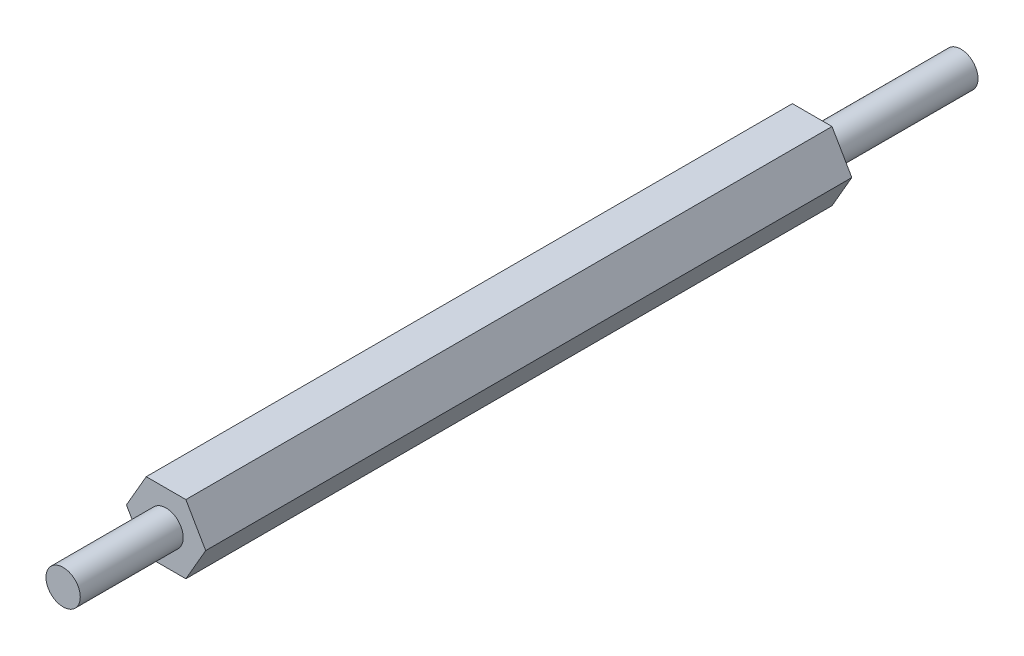
ISO-10303-21;
HEADER;
FILE_DESCRIPTION(('STEP AP214'),'2;1');
FILE_NAME('part.step','',(''),(''),'','','');
FILE_SCHEMA(('AUTOMOTIVE_DESIGN { 1 0 10303 214 1 1 1 1 }'));
ENDSEC;
DATA;
#1=APPLICATION_CONTEXT('core data for automotive mechanical design processes');
#2=APPLICATION_PROTOCOL_DEFINITION('international standard','automotive_design',2000,#1);
#3=PRODUCT_CONTEXT('',#1,'mechanical');
#4=PRODUCT('Part','Part','',(#3));
#5=PRODUCT_RELATED_PRODUCT_CATEGORY('part','',(#4));
#6=PRODUCT_DEFINITION_FORMATION('','',#4);
#7=PRODUCT_DEFINITION_CONTEXT('part definition',#1,'design');
#8=PRODUCT_DEFINITION('design','',#6,#7);
#9=PRODUCT_DEFINITION_SHAPE('','',#8);
#10=(LENGTH_UNIT() NAMED_UNIT(*) SI_UNIT(.MILLI.,.METRE.));
#11=(NAMED_UNIT(*) PLANE_ANGLE_UNIT() SI_UNIT($,.RADIAN.));
#12=(NAMED_UNIT(*) SI_UNIT($,.STERADIAN.) SOLID_ANGLE_UNIT());
#13=UNCERTAINTY_MEASURE_WITH_UNIT(LENGTH_MEASURE(1.E-05),#10,'distance_accuracy_value','');
#14=(GEOMETRIC_REPRESENTATION_CONTEXT(3) GLOBAL_UNCERTAINTY_ASSIGNED_CONTEXT((#13)) GLOBAL_UNIT_ASSIGNED_CONTEXT((#10,
#11,#12)) REPRESENTATION_CONTEXT('',''));
#15=CARTESIAN_POINT('',(0.,0.,0.));
#16=DIRECTION('',(0.,0.,1.));
#17=DIRECTION('',(1.,0.,0.));
#18=AXIS2_PLACEMENT_3D('',#15,#16,#17);
#19=CARTESIAN_POINT('',(1.73205080756891,-2.99999999999998,56.5));
#20=DIRECTION('',(-0.866025403784442,0.499999999999995,0.));
#21=DIRECTION('',(-0.499999999999995,-0.866025403784442,0.));
#22=AXIS2_PLACEMENT_3D('',#19,#20,#21);
#23=PLANE('',#22);
#24=DIRECTION('',(0.499999999999995,0.866025403784441,0.));
#25=VECTOR('',#24,1.);
#26=CARTESIAN_POINT('',(1.73205080756891,-2.99999999999998,0.));
#27=LINE('',#26,#25);
#28=CARTESIAN_POINT('',(1.73205080756891,-2.99999999999998,0.));
#29=VERTEX_POINT('',#28);
#30=CARTESIAN_POINT('',(3.46410161513775,0.,0.));
#31=VERTEX_POINT('',#30);
#32=EDGE_CURVE('E121',#29,#31,#27,.T.);
#33=ORIENTED_EDGE('',*,*,#32,.T.);
#34=DIRECTION('',(0.,0.,-1.));
#35=VECTOR('',#34,1.);
#36=CARTESIAN_POINT('',(3.46410161513775,0.,56.5));
#37=LINE('',#36,#35);
#38=CARTESIAN_POINT('',(3.46410161513775,0.,56.5));
#39=VERTEX_POINT('',#38);
#40=EDGE_CURVE('E38',#39,#31,#37,.T.);
#41=ORIENTED_EDGE('',*,*,#40,.F.);
#42=DIRECTION('',(0.499999999999995,0.866025403784441,0.));
#43=VECTOR('',#42,1.);
#44=CARTESIAN_POINT('',(1.73205080756891,-2.99999999999998,56.5));
#45=LINE('',#44,#43);
#46=CARTESIAN_POINT('',(1.73205080756891,-2.99999999999998,56.5));
#47=VERTEX_POINT('',#46);
#48=EDGE_CURVE('E132',#47,#39,#45,.T.);
#49=ORIENTED_EDGE('',*,*,#48,.F.);
#50=DIRECTION('',(0.,0.,-1.));
#51=VECTOR('',#50,1.);
#52=CARTESIAN_POINT('',(1.73205080756891,-2.99999999999998,56.5));
#53=LINE('',#52,#51);
#54=EDGE_CURVE('E117',#47,#29,#53,.T.);
#55=ORIENTED_EDGE('',*,*,#54,.T.);
#56=EDGE_LOOP('',(#33,#41,#49,#55));
#57=FACE_BOUND('',#56,.T.);
#58=ADVANCED_FACE('F35',(#57),#23,.F.);
#59=CARTESIAN_POINT('',(3.46410161513775,0.,56.5));
#60=DIRECTION('',(-0.866025403784438,-0.500000000000001,0.));
#61=DIRECTION('',(0.500000000000001,-0.866025403784438,0.));
#62=AXIS2_PLACEMENT_3D('',#59,#60,#61);
#63=PLANE('',#62);
#64=DIRECTION('',(-0.500000000000001,0.866025403784438,0.));
#65=VECTOR('',#64,1.);
#66=CARTESIAN_POINT('',(3.46410161513775,0.,0.));
#67=LINE('',#66,#65);
#68=CARTESIAN_POINT('',(1.73205080756887,3.,0.));
#69=VERTEX_POINT('',#68);
#70=EDGE_CURVE('E124',#31,#69,#67,.T.);
#71=ORIENTED_EDGE('',*,*,#70,.T.);
#72=DIRECTION('',(0.,0.,-1.));
#73=VECTOR('',#72,1.);
#74=CARTESIAN_POINT('',(1.73205080756887,3.,56.5));
#75=LINE('',#74,#73);
#76=CARTESIAN_POINT('',(1.73205080756887,3.,56.5));
#77=VERTEX_POINT('',#76);
#78=EDGE_CURVE('E135',#77,#69,#75,.T.);
#79=ORIENTED_EDGE('',*,*,#78,.F.);
#80=DIRECTION('',(-0.500000000000001,0.866025403784438,0.));
#81=VECTOR('',#80,1.);
#82=CARTESIAN_POINT('',(3.46410161513775,0.,56.5));
#83=LINE('',#82,#81);
#84=EDGE_CURVE('E90',#39,#77,#83,.T.);
#85=ORIENTED_EDGE('',*,*,#84,.F.);
#86=ORIENTED_EDGE('',*,*,#40,.T.);
#87=EDGE_LOOP('',(#71,#79,#85,#86));
#88=FACE_BOUND('',#87,.T.);
#89=ADVANCED_FACE('F140',(#88),#63,.F.);
#90=CARTESIAN_POINT('',(1.73205080756887,3.,56.5));
#91=DIRECTION('',(0.,-1.,0.));
#92=DIRECTION('',(1.,0.,0.));
#93=AXIS2_PLACEMENT_3D('',#90,#91,#92);
#94=PLANE('',#93);
#95=DIRECTION('',(-1.,0.,0.));
#96=VECTOR('',#95,1.);
#97=CARTESIAN_POINT('',(1.73205080756887,3.,0.));
#98=LINE('',#97,#96);
#99=CARTESIAN_POINT('',(-1.73205080756889,2.99999999999999,0.));
#100=VERTEX_POINT('',#99);
#101=EDGE_CURVE('E127',#69,#100,#98,.T.);
#102=ORIENTED_EDGE('',*,*,#101,.T.);
#103=DIRECTION('',(0.,0.,-1.));
#104=VECTOR('',#103,1.);
#105=CARTESIAN_POINT('',(-1.73205080756889,2.99999999999999,56.5));
#106=LINE('',#105,#104);
#107=CARTESIAN_POINT('',(-1.73205080756889,2.99999999999999,56.5));
#108=VERTEX_POINT('',#107);
#109=EDGE_CURVE('E112',#108,#100,#106,.T.);
#110=ORIENTED_EDGE('',*,*,#109,.F.);
#111=DIRECTION('',(-1.,0.,0.));
#112=VECTOR('',#111,1.);
#113=CARTESIAN_POINT('',(1.73205080756887,3.,56.5));
#114=LINE('',#113,#112);
#115=EDGE_CURVE('E103',#77,#108,#114,.T.);
#116=ORIENTED_EDGE('',*,*,#115,.F.);
#117=ORIENTED_EDGE('',*,*,#78,.T.);
#118=EDGE_LOOP('',(#102,#110,#116,#117));
#119=FACE_BOUND('',#118,.T.);
#120=ADVANCED_FACE('F146',(#119),#94,.F.);
#121=CARTESIAN_POINT('',(-1.73205080756889,2.99999999999999,56.5));
#122=DIRECTION('',(0.866025403784442,-0.499999999999995,0.));
#123=DIRECTION('',(0.499999999999995,0.866025403784442,0.));
#124=AXIS2_PLACEMENT_3D('',#121,#122,#123);
#125=PLANE('',#124);
#126=DIRECTION('',(-0.499999999999995,-0.866025403784442,0.));
#127=VECTOR('',#126,1.);
#128=CARTESIAN_POINT('',(-1.73205080756889,2.99999999999999,0.));
#129=LINE('',#128,#127);
#130=CARTESIAN_POINT('',(-3.46410161513775,0.,0.));
#131=VERTEX_POINT('',#130);
#132=EDGE_CURVE('E111',#100,#131,#129,.T.);
#133=ORIENTED_EDGE('',*,*,#132,.T.);
#134=DIRECTION('',(0.,0.,-1.));
#135=VECTOR('',#134,1.);
#136=CARTESIAN_POINT('',(-3.46410161513775,0.,56.5));
#137=LINE('',#136,#135);
#138=CARTESIAN_POINT('',(-3.46410161513775,0.,56.5));
#139=VERTEX_POINT('',#138);
#140=EDGE_CURVE('E108',#139,#131,#137,.T.);
#141=ORIENTED_EDGE('',*,*,#140,.F.);
#142=DIRECTION('',(-0.499999999999995,-0.866025403784442,0.));
#143=VECTOR('',#142,1.);
#144=CARTESIAN_POINT('',(-1.73205080756889,2.99999999999999,56.5));
#145=LINE('',#144,#143);
#146=EDGE_CURVE('E97',#108,#139,#145,.T.);
#147=ORIENTED_EDGE('',*,*,#146,.F.);
#148=ORIENTED_EDGE('',*,*,#109,.T.);
#149=EDGE_LOOP('',(#133,#141,#147,#148));
#150=FACE_BOUND('',#149,.T.);
#151=ADVANCED_FACE('F109',(#150),#125,.F.);
#152=CARTESIAN_POINT('',(-3.46410161513775,0.,56.5));
#153=DIRECTION('',(0.866025403784435,0.500000000000007,0.));
#154=DIRECTION('',(-0.500000000000007,0.866025403784434,0.));
#155=AXIS2_PLACEMENT_3D('',#152,#153,#154);
#156=PLANE('',#155);
#157=DIRECTION('',(0.500000000000007,-0.866025403784435,0.));
#158=VECTOR('',#157,1.);
#159=CARTESIAN_POINT('',(-3.46410161513775,0.,0.));
#160=LINE('',#159,#158);
#161=CARTESIAN_POINT('',(-1.73205080756885,-3.00000000000002,0.));
#162=VERTEX_POINT('',#161);
#163=EDGE_CURVE('E75',#131,#162,#160,.T.);
#164=ORIENTED_EDGE('',*,*,#163,.T.);
#165=DIRECTION('',(0.,0.,-1.));
#166=VECTOR('',#165,1.);
#167=CARTESIAN_POINT('',(-1.73205080756885,-3.00000000000002,56.5));
#168=LINE('',#167,#166);
#169=CARTESIAN_POINT('',(-1.73205080756885,-3.00000000000002,56.5));
#170=VERTEX_POINT('',#169);
#171=EDGE_CURVE('E113',#170,#162,#168,.T.);
#172=ORIENTED_EDGE('',*,*,#171,.F.);
#173=DIRECTION('',(0.500000000000007,-0.866025403784435,0.));
#174=VECTOR('',#173,1.);
#175=CARTESIAN_POINT('',(-3.46410161513775,0.,56.5));
#176=LINE('',#175,#174);
#177=EDGE_CURVE('E101',#139,#170,#176,.T.);
#178=ORIENTED_EDGE('',*,*,#177,.F.);
#179=ORIENTED_EDGE('',*,*,#140,.T.);
#180=EDGE_LOOP('',(#164,#172,#178,#179));
#181=FACE_BOUND('',#180,.T.);
#182=ADVANCED_FACE('F115',(#181),#156,.F.);
#183=CARTESIAN_POINT('',(-1.73205080756885,-3.00000000000002,56.5));
#184=DIRECTION('',(0.,1.,0.));
#185=DIRECTION('',(-1.,0.,0.));
#186=AXIS2_PLACEMENT_3D('',#183,#184,#185);
#187=PLANE('',#186);
#188=DIRECTION('',(1.,0.,0.));
#189=VECTOR('',#188,1.);
#190=CARTESIAN_POINT('',(-1.73205080756885,-3.00000000000002,0.));
#191=LINE('',#190,#189);
#192=EDGE_CURVE('E81',#162,#29,#191,.T.);
#193=ORIENTED_EDGE('',*,*,#192,.T.);
#194=ORIENTED_EDGE('',*,*,#54,.F.);
#195=DIRECTION('',(1.,0.,0.));
#196=VECTOR('',#195,1.);
#197=CARTESIAN_POINT('',(-1.73205080756885,-3.00000000000002,56.5));
#198=LINE('',#197,#196);
#199=EDGE_CURVE('E52',#170,#47,#198,.T.);
#200=ORIENTED_EDGE('',*,*,#199,.F.);
#201=ORIENTED_EDGE('',*,*,#171,.T.);
#202=EDGE_LOOP('',(#193,#194,#200,#201));
#203=FACE_BOUND('',#202,.T.);
#204=ADVANCED_FACE('F169',(#203),#187,.F.);
#205=CARTESIAN_POINT('',(0.,0.,56.5));
#206=DIRECTION('',(0.,0.,1.));
#207=DIRECTION('',(1.,0.,0.));
#208=AXIS2_PLACEMENT_3D('',#205,#206,#207);
#209=PLANE('',#208);
#210=CARTESIAN_POINT('',(0.,0.,56.5));
#211=DIRECTION('',(0.,0.,1.));
#212=DIRECTION('',(1.,0.,0.));
#213=AXIS2_PLACEMENT_3D('',#210,#211,#212);
#214=CIRCLE('',#213,1.5);
#215=CARTESIAN_POINT('',(1.5,0.,56.5));
#216=VERTEX_POINT('',#215);
#217=EDGE_CURVE('E11',#216,#216,#214,.T.);
#218=ORIENTED_EDGE('',*,*,#217,.F.);
#219=EDGE_LOOP('',(#218));
#220=FACE_BOUND('',#219,.T.);
#221=ORIENTED_EDGE('',*,*,#48,.T.);
#222=ORIENTED_EDGE('',*,*,#84,.T.);
#223=ORIENTED_EDGE('',*,*,#115,.T.);
#224=ORIENTED_EDGE('',*,*,#146,.T.);
#225=ORIENTED_EDGE('',*,*,#177,.T.);
#226=ORIENTED_EDGE('',*,*,#199,.T.);
#227=EDGE_LOOP('',(#221,#222,#223,#224,#225,#226));
#228=FACE_BOUND('',#227,.T.);
#229=ADVANCED_FACE('F99',(#220,#228),#209,.T.);
#230=CARTESIAN_POINT('',(0.,0.,0.));
#231=DIRECTION('',(0.,0.,1.));
#232=DIRECTION('',(1.,0.,0.));
#233=AXIS2_PLACEMENT_3D('',#230,#231,#232);
#234=PLANE('',#233);
#235=CARTESIAN_POINT('',(0.,0.,0.));
#236=DIRECTION('',(0.,0.,1.));
#237=DIRECTION('',(1.,0.,0.));
#238=AXIS2_PLACEMENT_3D('',#235,#236,#237);
#239=CIRCLE('',#238,1.5);
#240=CARTESIAN_POINT('',(-1.5,0.,0.));
#241=VERTEX_POINT('',#240);
#242=EDGE_CURVE('E125',#241,#241,#239,.T.);
#243=ORIENTED_EDGE('',*,*,#242,.T.);
#244=EDGE_LOOP('',(#243));
#245=FACE_BOUND('',#244,.T.);
#246=ORIENTED_EDGE('',*,*,#32,.F.);
#247=ORIENTED_EDGE('',*,*,#192,.F.);
#248=ORIENTED_EDGE('',*,*,#163,.F.);
#249=ORIENTED_EDGE('',*,*,#132,.F.);
#250=ORIENTED_EDGE('',*,*,#101,.F.);
#251=ORIENTED_EDGE('',*,*,#70,.F.);
#252=EDGE_LOOP('',(#246,#247,#248,#249,#250,#251));
#253=FACE_BOUND('',#252,.T.);
#254=ADVANCED_FACE('F145',(#245,#253),#234,.F.);
#255=CARTESIAN_POINT('',(0.,0.,0.));
#256=DIRECTION('',(0.,0.,-1.));
#257=DIRECTION('',(-1.,0.,0.));
#258=AXIS2_PLACEMENT_3D('',#255,#256,#257);
#259=CYLINDRICAL_SURFACE('',#258,1.5);
#260=CARTESIAN_POINT('',(0.,0.,-13.));
#261=DIRECTION('',(0.,0.,1.));
#262=DIRECTION('',(1.,0.,0.));
#263=AXIS2_PLACEMENT_3D('',#260,#261,#262);
#264=CIRCLE('',#263,1.5);
#265=CARTESIAN_POINT('',(-1.5,0.,-13.));
#266=VERTEX_POINT('',#265);
#267=EDGE_CURVE('E150',#266,#266,#264,.T.);
#268=CARTESIAN_POINT('',(-1.5,0.,0.));
#269=CARTESIAN_POINT('',(-1.5,0.,-0.135416666666666));
#270=CARTESIAN_POINT('',(-1.5,0.,-0.270833333333333));
#271=CARTESIAN_POINT('',(-1.5,0.,-0.541666666666667));
#272=CARTESIAN_POINT('',(-1.5,0.,-0.677083333333333));
#273=CARTESIAN_POINT('',(-1.5,0.,-0.947916666666667));
#274=CARTESIAN_POINT('',(-1.5,0.,-1.08333333333333));
#275=CARTESIAN_POINT('',(-1.5,0.,-1.35416666666667));
#276=CARTESIAN_POINT('',(-1.5,0.,-1.48958333333333));
#277=CARTESIAN_POINT('',(-1.5,0.,-1.76041666666667));
#278=CARTESIAN_POINT('',(-1.5,0.,-1.89583333333333));
#279=CARTESIAN_POINT('',(-1.5,0.,-2.16666666666667));
#280=CARTESIAN_POINT('',(-1.5,0.,-2.30208333333333));
#281=CARTESIAN_POINT('',(-1.5,0.,-2.57291666666667));
#282=CARTESIAN_POINT('',(-1.5,0.,-2.70833333333333));
#283=CARTESIAN_POINT('',(-1.5,0.,-2.97916666666667));
#284=CARTESIAN_POINT('',(-1.5,0.,-3.11458333333333));
#285=CARTESIAN_POINT('',(-1.5,0.,-3.38541666666667));
#286=CARTESIAN_POINT('',(-1.5,0.,-3.52083333333333));
#287=CARTESIAN_POINT('',(-1.5,0.,-3.79166666666667));
#288=CARTESIAN_POINT('',(-1.5,0.,-3.92708333333333));
#289=CARTESIAN_POINT('',(-1.5,0.,-4.19791666666667));
#290=CARTESIAN_POINT('',(-1.5,0.,-4.33333333333333));
#291=CARTESIAN_POINT('',(-1.5,0.,-4.60416666666667));
#292=CARTESIAN_POINT('',(-1.5,0.,-4.73958333333333));
#293=CARTESIAN_POINT('',(-1.5,0.,-5.01041666666667));
#294=CARTESIAN_POINT('',(-1.5,0.,-5.14583333333333));
#295=CARTESIAN_POINT('',(-1.5,0.,-5.41666666666667));
#296=CARTESIAN_POINT('',(-1.5,0.,-5.55208333333333));
#297=CARTESIAN_POINT('',(-1.5,0.,-5.82291666666667));
#298=CARTESIAN_POINT('',(-1.5,0.,-5.95833333333333));
#299=CARTESIAN_POINT('',(-1.5,0.,-6.22916666666667));
#300=CARTESIAN_POINT('',(-1.5,0.,-6.36458333333333));
#301=CARTESIAN_POINT('',(-1.5,0.,-6.63541666666667));
#302=CARTESIAN_POINT('',(-1.5,0.,-6.77083333333333));
#303=CARTESIAN_POINT('',(-1.5,0.,-7.04166666666667));
#304=CARTESIAN_POINT('',(-1.5,0.,-7.17708333333333));
#305=CARTESIAN_POINT('',(-1.5,0.,-7.44791666666667));
#306=CARTESIAN_POINT('',(-1.5,0.,-7.58333333333333));
#307=CARTESIAN_POINT('',(-1.5,0.,-7.85416666666667));
#308=CARTESIAN_POINT('',(-1.5,0.,-7.98958333333333));
#309=CARTESIAN_POINT('',(-1.5,0.,-8.26041666666667));
#310=CARTESIAN_POINT('',(-1.5,0.,-8.39583333333333));
#311=CARTESIAN_POINT('',(-1.5,0.,-8.66666666666667));
#312=CARTESIAN_POINT('',(-1.5,0.,-8.80208333333333));
#313=CARTESIAN_POINT('',(-1.5,0.,-9.07291666666667));
#314=CARTESIAN_POINT('',(-1.5,0.,-9.20833333333333));
#315=CARTESIAN_POINT('',(-1.5,0.,-9.47916666666667));
#316=CARTESIAN_POINT('',(-1.5,0.,-9.61458333333333));
#317=CARTESIAN_POINT('',(-1.5,0.,-9.88541666666667));
#318=CARTESIAN_POINT('',(-1.5,0.,-10.0208333333333));
#319=CARTESIAN_POINT('',(-1.5,0.,-10.2916666666667));
#320=CARTESIAN_POINT('',(-1.5,0.,-10.4270833333333));
#321=CARTESIAN_POINT('',(-1.5,0.,-10.6979166666667));
#322=CARTESIAN_POINT('',(-1.5,0.,-10.8333333333333));
#323=CARTESIAN_POINT('',(-1.5,0.,-11.1041666666667));
#324=CARTESIAN_POINT('',(-1.5,0.,-11.2395833333333));
#325=CARTESIAN_POINT('',(-1.5,0.,-11.5104166666667));
#326=CARTESIAN_POINT('',(-1.5,0.,-11.6458333333333));
#327=CARTESIAN_POINT('',(-1.5,0.,-11.9166666666667));
#328=CARTESIAN_POINT('',(-1.5,0.,-12.0520833333333));
#329=CARTESIAN_POINT('',(-1.5,0.,-12.3229166666667));
#330=CARTESIAN_POINT('',(-1.5,0.,-12.4583333333333));
#331=CARTESIAN_POINT('',(-1.5,0.,-12.7291666666667));
#332=CARTESIAN_POINT('',(-1.5,0.,-12.8645833333333));
#333=CARTESIAN_POINT('',(-1.5,0.,-13.));
#334=B_SPLINE_CURVE_WITH_KNOTS('',3,(#268,#269,#270,#271,#272,#273,#274,#275,#276,#277,#278,
#279,#280,#281,#282,#283,#284,#285,#286,#287,#288,#289,#290,#291,#292,#293,#294,#295,#296,#297,
#298,#299,#300,#301,#302,#303,#304,#305,#306,#307,#308,#309,#310,#311,#312,#313,#314,#315,#316,
#317,#318,#319,#320,#321,#322,#323,#324,#325,#326,#327,#328,#329,#330,#331,#332,#333),
.UNSPECIFIED.,.F.,.F.,(4,2,2,2,2,2,2,2,2,2,2,2,2,2,2,2,2,2,2,2,2,2,2,2,2,2,2,2,2,2,2,2,4),(0.,
0.40625,0.8125,1.21875,1.625,2.03125,2.4375,2.84375,3.25,3.65625,4.0625,4.46875,4.875,5.28125,
5.6875,6.09375,6.5,6.90625,7.3125,7.71875,8.125,8.53125,8.9375,9.34375,9.75,10.15625,10.5625,
10.96875,11.375,11.78125,12.1875,12.59375,13.),.UNSPECIFIED.);
#335=EDGE_CURVE('BSEAM175',#241,#266,#334,.T.);
#336=ORIENTED_EDGE('',*,*,#242,.F.);
#337=ORIENTED_EDGE('',*,*,#267,.T.);
#338=ORIENTED_EDGE('',*,*,#335,.T.);
#339=ORIENTED_EDGE('',*,*,#335,.F.);
#340=EDGE_LOOP('',(#336,#338,#337,#339));
#341=FACE_BOUND('',#340,.T.);
#342=ADVANCED_FACE('F175',(#341),#259,.T.);
#343=CARTESIAN_POINT('',(0.,0.,-13.));
#344=DIRECTION('',(0.,0.,1.));
#345=DIRECTION('',(1.,0.,0.));
#346=AXIS2_PLACEMENT_3D('',#343,#344,#345);
#347=PLANE('',#346);
#348=ORIENTED_EDGE('',*,*,#267,.F.);
#349=EDGE_LOOP('',(#348));
#350=FACE_BOUND('',#349,.T.);
#351=ADVANCED_FACE('F164',(#350),#347,.F.);
#352=CARTESIAN_POINT('',(0.,0.,65.5));
#353=DIRECTION('',(0.,0.,-1.));
#354=DIRECTION('',(-1.,0.,0.));
#355=AXIS2_PLACEMENT_3D('',#352,#353,#354);
#356=CYLINDRICAL_SURFACE('',#355,1.5);
#357=CARTESIAN_POINT('',(0.,0.,65.5));
#358=DIRECTION('',(0.,0.,1.));
#359=DIRECTION('',(1.,0.,0.));
#360=AXIS2_PLACEMENT_3D('',#357,#358,#359);
#361=CIRCLE('',#360,1.5);
#362=CARTESIAN_POINT('',(1.5,0.,65.5));
#363=VERTEX_POINT('',#362);
#364=EDGE_CURVE('E153',#363,#363,#361,.T.);
#365=ORIENTED_EDGE('',*,*,#364,.F.);
#366=EDGE_LOOP('',(#365));
#367=FACE_BOUND('',#366,.T.);
#368=ORIENTED_EDGE('',*,*,#217,.T.);
#369=EDGE_LOOP('',(#368));
#370=FACE_BOUND('',#369,.T.);
#371=ADVANCED_FACE('F161',(#367,#370),#356,.T.);
#372=CARTESIAN_POINT('',(0.,0.,65.5));
#373=DIRECTION('',(0.,0.,1.));
#374=DIRECTION('',(1.,0.,0.));
#375=AXIS2_PLACEMENT_3D('',#372,#373,#374);
#376=PLANE('',#375);
#377=ORIENTED_EDGE('',*,*,#364,.T.);
#378=EDGE_LOOP('',(#377));
#379=FACE_BOUND('',#378,.T.);
#380=ADVANCED_FACE('F159',(#379),#376,.T.);
#381=CLOSED_SHELL('',(#58,#89,#120,#151,#182,#204,#229,#254,#342,#351,#371,#380));
#382=MANIFOLD_SOLID_BREP('B2',#381);
#383=ADVANCED_BREP_SHAPE_REPRESENTATION('',(#18,#382),#14);
#384=SHAPE_DEFINITION_REPRESENTATION(#9,#383);
ENDSEC;
END-ISO-10303-21;
